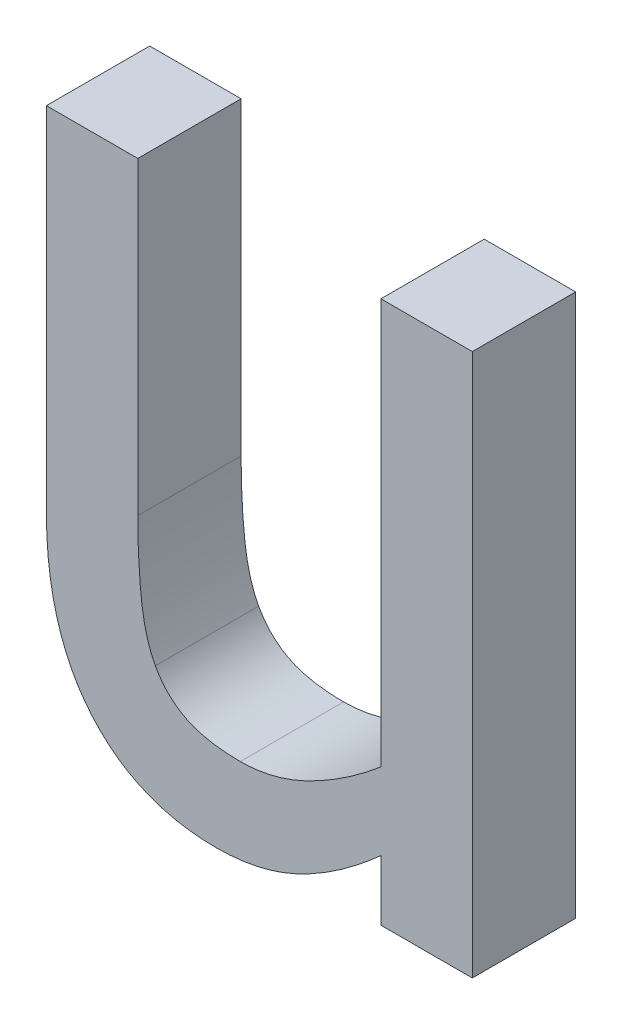
ISO-10303-21;
HEADER;
FILE_DESCRIPTION(('STEP AP214'),'2;1');
FILE_NAME('part.step','',(''),(''),'','','');
FILE_SCHEMA(('AUTOMOTIVE_DESIGN { 1 0 10303 214 1 1 1 1 }'));
ENDSEC;
DATA;
#1=APPLICATION_CONTEXT('core data for automotive mechanical design processes');
#2=APPLICATION_PROTOCOL_DEFINITION('international standard','automotive_design',2000,#1);
#3=PRODUCT_CONTEXT('',#1,'mechanical');
#4=PRODUCT('Part','Part','',(#3));
#5=PRODUCT_RELATED_PRODUCT_CATEGORY('part','',(#4));
#6=PRODUCT_DEFINITION_FORMATION('','',#4);
#7=PRODUCT_DEFINITION_CONTEXT('part definition',#1,'design');
#8=PRODUCT_DEFINITION('design','',#6,#7);
#9=PRODUCT_DEFINITION_SHAPE('','',#8);
#10=(LENGTH_UNIT() NAMED_UNIT(*) SI_UNIT(.MILLI.,.METRE.));
#11=(NAMED_UNIT(*) PLANE_ANGLE_UNIT() SI_UNIT($,.RADIAN.));
#12=(NAMED_UNIT(*) SI_UNIT($,.STERADIAN.) SOLID_ANGLE_UNIT());
#13=UNCERTAINTY_MEASURE_WITH_UNIT(LENGTH_MEASURE(1.E-05),#10,'distance_accuracy_value','');
#14=(GEOMETRIC_REPRESENTATION_CONTEXT(3) GLOBAL_UNCERTAINTY_ASSIGNED_CONTEXT((#13)) GLOBAL_UNIT_ASSIGNED_CONTEXT((#10,
#11,#12)) REPRESENTATION_CONTEXT('',''));
#15=CARTESIAN_POINT('',(0.,0.,0.));
#16=DIRECTION('',(0.,0.,1.));
#17=DIRECTION('',(1.,0.,0.));
#18=AXIS2_PLACEMENT_3D('',#15,#16,#17);
#19=CARTESIAN_POINT('',(-0.203772653395314,0.984918799111126,0.));
#20=DIRECTION('',(1.,0.,0.));
#21=DIRECTION('',(0.,1.,0.));
#22=AXIS2_PLACEMENT_3D('',#19,#20,#21);
#23=PLANE('',#22);
#24=DIRECTION('',(0.,-1.,0.));
#25=VECTOR('',#24,1.);
#26=CARTESIAN_POINT('',(-0.203772653395314,1.28436413185,0.));
#27=LINE('',#26,#25);
#28=CARTESIAN_POINT('',(-0.203772653395314,1.28436413185,0.));
#29=VERTEX_POINT('',#28);
#30=CARTESIAN_POINT('',(-0.203772653395314,0.984918799111126,0.));
#31=VERTEX_POINT('',#30);
#32=EDGE_CURVE('E11',#29,#31,#27,.T.);
#33=ORIENTED_EDGE('',*,*,#32,.F.);
#34=DIRECTION('',(0.,0.,1.));
#35=VECTOR('',#34,1.);
#36=CARTESIAN_POINT('',(-0.203772653395314,1.28436413185,0.));
#37=LINE('',#36,#35);
#38=CARTESIAN_POINT('',(-0.203772653395314,1.28436413185,0.1));
#39=VERTEX_POINT('',#38);
#40=EDGE_CURVE('E24',#29,#39,#37,.T.);
#41=ORIENTED_EDGE('',*,*,#40,.T.);
#42=DIRECTION('',(0.,1.,0.));
#43=VECTOR('',#42,1.);
#44=CARTESIAN_POINT('',(-0.203772653395314,1.28436413185,0.1));
#45=LINE('',#44,#43);
#46=CARTESIAN_POINT('',(-0.203772653395314,0.984918799111126,0.1));
#47=VERTEX_POINT('',#46);
#48=EDGE_CURVE('E130',#47,#39,#45,.T.);
#49=ORIENTED_EDGE('',*,*,#48,.F.);
#50=DIRECTION('',(0.,0.,1.));
#51=VECTOR('',#50,1.);
#52=CARTESIAN_POINT('',(-0.203772653395314,0.984918799111126,0.));
#53=LINE('',#52,#51);
#54=EDGE_CURVE('E258',#31,#47,#53,.T.);
#55=ORIENTED_EDGE('',*,*,#54,.F.);
#56=EDGE_LOOP('',(#33,#41,#49,#55));
#57=FACE_BOUND('',#56,.T.);
#58=ADVANCED_FACE('F17',(#57),#23,.T.);
#59=CARTESIAN_POINT('',(-0.186758714035148,0.867522617525982,0.));
#60=CARTESIAN_POINT('',(-0.186758714035148,0.867522617525982,0.1));
#61=CARTESIAN_POINT('',(-0.196967077651248,0.886237950822165,0.));
#62=CARTESIAN_POINT('',(-0.196967077651248,0.886237950822165,0.1));
#63=CARTESIAN_POINT('',(-0.203772653395314,0.948622395142772,0.));
#64=CARTESIAN_POINT('',(-0.203772653395314,0.948622395142772,0.1));
#65=CARTESIAN_POINT('',(-0.203772653395314,0.984918799111126,0.));
#66=CARTESIAN_POINT('',(-0.203772653395314,0.984918799111126,0.1));
#67=B_SPLINE_SURFACE_WITH_KNOTS('',2,1,((#59,#60),(#61,#62),(#63,#64),(#65,#66)),.UNSPECIFIED.,
.F.,.F.,.F.,(3,1,3),(2,2),(-2.,-1.,0.),(0.,0.01),.UNSPECIFIED.);
#68=CARTESIAN_POINT('',(-0.203772653395314,0.984918799111126,0.));
#69=CARTESIAN_POINT('',(-0.203772653395314,0.948622395142772,0.));
#70=CARTESIAN_POINT('',(-0.196967077651248,0.886237950822165,0.));
#71=CARTESIAN_POINT('',(-0.186758714035148,0.867522617525982,0.));
#72=B_SPLINE_CURVE_WITH_KNOTS('',2,(#68,#69,#70,#71),.UNSPECIFIED.,.F.,.F.,(3,1,3),(0.,1.,2.),.UNSPECIFIED.);
#73=CARTESIAN_POINT('',(-0.186758714035148,0.867522617525982,0.));
#74=VERTEX_POINT('',#73);
#75=EDGE_CURVE('E251',#31,#74,#72,.T.);
#76=CARTESIAN_POINT('',(-0.186758714035148,0.867522617525982,0.1));
#77=CARTESIAN_POINT('',(-0.196967077651248,0.886237950822165,0.1));
#78=CARTESIAN_POINT('',(-0.203772653395314,0.948622395142772,0.1));
#79=CARTESIAN_POINT('',(-0.203772653395314,0.984918799111126,0.1));
#80=B_SPLINE_CURVE_WITH_KNOTS('',2,(#76,#77,#78,#79),.UNSPECIFIED.,.F.,.F.,(3,1,3),(-2.,-1.,0.),.UNSPECIFIED.);
#81=CARTESIAN_POINT('',(-0.186758714035148,0.867522617525982,0.1));
#82=VERTEX_POINT('',#81);
#83=EDGE_CURVE('E247',#82,#47,#80,.T.);
#84=DIRECTION('',(0.,0.,1.));
#85=VECTOR('',#84,1.);
#86=CARTESIAN_POINT('',(-0.186758714035148,0.867522617525982,0.));
#87=LINE('',#86,#85);
#88=EDGE_CURVE('E241',#74,#82,#87,.T.);
#89=ORIENTED_EDGE('',*,*,#75,.F.);
#90=ORIENTED_EDGE('',*,*,#54,.T.);
#91=ORIENTED_EDGE('',*,*,#83,.F.);
#92=ORIENTED_EDGE('',*,*,#88,.F.);
#93=EDGE_LOOP('',(#89,#90,#91,#92));
#94=FACE_BOUND('',#93,.T.);
#95=ADVANCED_FACE('F303',(#94),#67,.T.);
#96=CARTESIAN_POINT('',(-0.104524673794347,0.828390556997601,0.));
#97=CARTESIAN_POINT('',(-0.104524673794347,0.828390556997601,0.1));
#98=CARTESIAN_POINT('',(-0.137418289890668,0.828390556997601,0.));
#99=CARTESIAN_POINT('',(-0.137418289890668,0.828390556997601,0.1));
#100=CARTESIAN_POINT('',(-0.175983219107043,0.847673021605789,0.));
#101=CARTESIAN_POINT('',(-0.175983219107043,0.847673021605789,0.1));
#102=CARTESIAN_POINT('',(-0.186758714035148,0.867522617525982,0.));
#103=CARTESIAN_POINT('',(-0.186758714035148,0.867522617525982,0.1));
#104=B_SPLINE_SURFACE_WITH_KNOTS('',2,1,((#96,#97),(#98,#99),(#100,#101),(#102,#103)),
.UNSPECIFIED.,.F.,.F.,.F.,(3,1,3),(2,2),(-2.,-1.,0.),(0.,0.01),.UNSPECIFIED.);
#105=CARTESIAN_POINT('',(-0.186758714035148,0.867522617525982,0.));
#106=CARTESIAN_POINT('',(-0.175983219107043,0.847673021605789,0.));
#107=CARTESIAN_POINT('',(-0.137418289890668,0.828390556997601,0.));
#108=CARTESIAN_POINT('',(-0.104524673794347,0.828390556997601,0.));
#109=B_SPLINE_CURVE_WITH_KNOTS('',2,(#105,#106,#107,#108),.UNSPECIFIED.,.F.,.F.,(3,1,3),(0.,1.,
2.),.UNSPECIFIED.);
#110=CARTESIAN_POINT('',(-0.104524673794347,0.828390556997601,0.));
#111=VERTEX_POINT('',#110);
#112=EDGE_CURVE('E234',#74,#111,#109,.T.);
#113=CARTESIAN_POINT('',(-0.104524673794347,0.828390556997601,0.1));
#114=CARTESIAN_POINT('',(-0.137418289890668,0.828390556997601,0.1));
#115=CARTESIAN_POINT('',(-0.175983219107043,0.847673021605789,0.1));
#116=CARTESIAN_POINT('',(-0.186758714035148,0.867522617525982,0.1));
#117=B_SPLINE_CURVE_WITH_KNOTS('',2,(#113,#114,#115,#116),.UNSPECIFIED.,.F.,.F.,(3,1,3),(-2.,
-1.,0.),.UNSPECIFIED.);
#118=CARTESIAN_POINT('',(-0.104524673794347,0.828390556997601,0.1));
#119=VERTEX_POINT('',#118);
#120=EDGE_CURVE('E229',#119,#82,#117,.T.);
#121=DIRECTION('',(0.,0.,1.));
#122=VECTOR('',#121,1.);
#123=CARTESIAN_POINT('',(-0.104524673794347,0.828390556997601,0.));
#124=LINE('',#123,#122);
#125=EDGE_CURVE('E223',#111,#119,#124,.T.);
#126=ORIENTED_EDGE('',*,*,#112,.F.);
#127=ORIENTED_EDGE('',*,*,#88,.T.);
#128=ORIENTED_EDGE('',*,*,#120,.F.);
#129=ORIENTED_EDGE('',*,*,#125,.F.);
#130=EDGE_LOOP('',(#126,#127,#128,#129));
#131=FACE_BOUND('',#130,.T.);
#132=ADVANCED_FACE('F299',(#131),#104,.T.);
#133=CARTESIAN_POINT('',(0.0315868410869785,0.89190926394222,0.));
#134=CARTESIAN_POINT('',(0.0315868410869785,0.89190926394222,0.1));
#135=CARTESIAN_POINT('',(-0.00187390632134743,0.863552698341944,0.));
#136=CARTESIAN_POINT('',(-0.00187390632134743,0.863552698341944,0.1));
#137=CARTESIAN_POINT('',(-0.0716310576980267,0.828390556997601,0.));
#138=CARTESIAN_POINT('',(-0.0716310576980267,0.828390556997601,0.1));
#139=CARTESIAN_POINT('',(-0.104524673794347,0.828390556997601,0.));
#140=CARTESIAN_POINT('',(-0.104524673794347,0.828390556997601,0.1));
#141=B_SPLINE_SURFACE_WITH_KNOTS('',2,1,((#133,#134),(#135,#136),(#137,#138),(#139,#140)),
.UNSPECIFIED.,.F.,.F.,.F.,(3,1,3),(2,2),(-2.,-1.,0.),(0.,0.01),.UNSPECIFIED.);
#142=CARTESIAN_POINT('',(-0.104524673794347,0.828390556997601,0.));
#143=CARTESIAN_POINT('',(-0.0716310576980267,0.828390556997601,0.));
#144=CARTESIAN_POINT('',(-0.00187390632134743,0.863552698341944,0.));
#145=CARTESIAN_POINT('',(0.0315868410869785,0.89190926394222,0.));
#146=B_SPLINE_CURVE_WITH_KNOTS('',2,(#142,#143,#144,#145),.UNSPECIFIED.,.F.,.F.,(3,1,3),(0.,1.,
2.),.UNSPECIFIED.);
#147=CARTESIAN_POINT('',(0.0315868410869785,0.89190926394222,0.));
#148=VERTEX_POINT('',#147);
#149=EDGE_CURVE('E216',#111,#148,#146,.T.);
#150=CARTESIAN_POINT('',(0.0315868410869785,0.89190926394222,0.1));
#151=CARTESIAN_POINT('',(-0.00187390632134743,0.863552698341944,0.1));
#152=CARTESIAN_POINT('',(-0.0716310576980267,0.828390556997601,0.1));
#153=CARTESIAN_POINT('',(-0.104524673794347,0.828390556997601,0.1));
#154=B_SPLINE_CURVE_WITH_KNOTS('',2,(#150,#151,#152,#153),.UNSPECIFIED.,.F.,.F.,(3,1,3),(-2.,
-1.,0.),.UNSPECIFIED.);
#155=CARTESIAN_POINT('',(0.0315868410869785,0.89190926394222,0.1));
#156=VERTEX_POINT('',#155);
#157=EDGE_CURVE('E211',#156,#119,#154,.T.);
#158=DIRECTION('',(0.,0.,1.));
#159=VECTOR('',#158,1.);
#160=CARTESIAN_POINT('',(0.0315868410869785,0.89190926394222,0.));
#161=LINE('',#160,#159);
#162=EDGE_CURVE('E208',#148,#156,#161,.T.);
#163=ORIENTED_EDGE('',*,*,#149,.F.);
#164=ORIENTED_EDGE('',*,*,#125,.T.);
#165=ORIENTED_EDGE('',*,*,#157,.F.);
#166=ORIENTED_EDGE('',*,*,#162,.F.);
#167=EDGE_LOOP('',(#163,#164,#165,#166));
#168=FACE_BOUND('',#167,.T.);
#169=ADVANCED_FACE('F295',(#168),#141,.T.);
#170=CARTESIAN_POINT('',(0.0315868410869785,1.28436413185,0.));
#171=DIRECTION('',(-1.,0.,0.));
#172=DIRECTION('',(0.,-1.,0.));
#173=AXIS2_PLACEMENT_3D('',#170,#171,#172);
#174=PLANE('',#173);
#175=DIRECTION('',(0.,1.,0.));
#176=VECTOR('',#175,1.);
#177=CARTESIAN_POINT('',(0.0315868410869785,0.89190926394222,0.));
#178=LINE('',#177,#176);
#179=CARTESIAN_POINT('',(0.0315868410869785,1.28436413185,0.));
#180=VERTEX_POINT('',#179);
#181=EDGE_CURVE('E206',#148,#180,#178,.T.);
#182=ORIENTED_EDGE('',*,*,#181,.F.);
#183=ORIENTED_EDGE('',*,*,#162,.T.);
#184=DIRECTION('',(0.,-1.,0.));
#185=VECTOR('',#184,1.);
#186=CARTESIAN_POINT('',(0.0315868410869785,0.89190926394222,0.1));
#187=LINE('',#186,#185);
#188=CARTESIAN_POINT('',(0.0315868410869785,1.28436413185,0.1));
#189=VERTEX_POINT('',#188);
#190=EDGE_CURVE('E203',#189,#156,#187,.T.);
#191=ORIENTED_EDGE('',*,*,#190,.F.);
#192=DIRECTION('',(0.,0.,1.));
#193=VECTOR('',#192,1.);
#194=CARTESIAN_POINT('',(0.0315868410869785,1.28436413185,0.));
#195=LINE('',#194,#193);
#196=EDGE_CURVE('E200',#180,#189,#195,.T.);
#197=ORIENTED_EDGE('',*,*,#196,.F.);
#198=EDGE_LOOP('',(#182,#183,#191,#197));
#199=FACE_BOUND('',#198,.T.);
#200=ADVANCED_FACE('F291',(#199),#174,.T.);
#201=CARTESIAN_POINT('',(0.12005932575984,1.28436413185,0.));
#202=DIRECTION('',(0.,1.,0.));
#203=DIRECTION('',(-1.,0.,0.));
#204=AXIS2_PLACEMENT_3D('',#201,#202,#203);
#205=PLANE('',#204);
#206=DIRECTION('',(1.,0.,0.));
#207=VECTOR('',#206,1.);
#208=CARTESIAN_POINT('',(0.0315868410869785,1.28436413185,0.));
#209=LINE('',#208,#207);
#210=CARTESIAN_POINT('',(0.12005932575984,1.28436413185,0.));
#211=VERTEX_POINT('',#210);
#212=EDGE_CURVE('E198',#180,#211,#209,.T.);
#213=ORIENTED_EDGE('',*,*,#212,.F.);
#214=ORIENTED_EDGE('',*,*,#196,.T.);
#215=DIRECTION('',(-1.,0.,0.));
#216=VECTOR('',#215,1.);
#217=CARTESIAN_POINT('',(0.0315868410869785,1.28436413185,0.1));
#218=LINE('',#217,#216);
#219=CARTESIAN_POINT('',(0.12005932575984,1.28436413185,0.1));
#220=VERTEX_POINT('',#219);
#221=EDGE_CURVE('E195',#220,#189,#218,.T.);
#222=ORIENTED_EDGE('',*,*,#221,.F.);
#223=DIRECTION('',(0.,0.,1.));
#224=VECTOR('',#223,1.);
#225=CARTESIAN_POINT('',(0.12005932575984,1.28436413185,0.));
#226=LINE('',#225,#224);
#227=EDGE_CURVE('E192',#211,#220,#226,.T.);
#228=ORIENTED_EDGE('',*,*,#227,.F.);
#229=EDGE_LOOP('',(#213,#214,#222,#228));
#230=FACE_BOUND('',#229,.T.);
#231=ADVANCED_FACE('F287',(#230),#205,.T.);
#232=CARTESIAN_POINT('',(0.12005932575984,0.759200536932927,0.));
#233=DIRECTION('',(1.,0.,0.));
#234=DIRECTION('',(0.,1.,0.));
#235=AXIS2_PLACEMENT_3D('',#232,#233,#234);
#236=PLANE('',#235);
#237=DIRECTION('',(0.,-1.,0.));
#238=VECTOR('',#237,1.);
#239=CARTESIAN_POINT('',(0.12005932575984,1.28436413185,0.));
#240=LINE('',#239,#238);
#241=CARTESIAN_POINT('',(0.12005932575984,0.759200536932927,0.));
#242=VERTEX_POINT('',#241);
#243=EDGE_CURVE('E190',#211,#242,#240,.T.);
#244=ORIENTED_EDGE('',*,*,#243,.F.);
#245=ORIENTED_EDGE('',*,*,#227,.T.);
#246=DIRECTION('',(0.,1.,0.));
#247=VECTOR('',#246,1.);
#248=CARTESIAN_POINT('',(0.12005932575984,1.28436413185,0.1));
#249=LINE('',#248,#247);
#250=CARTESIAN_POINT('',(0.12005932575984,0.759200536932927,0.1));
#251=VERTEX_POINT('',#250);
#252=EDGE_CURVE('E187',#251,#220,#249,.T.);
#253=ORIENTED_EDGE('',*,*,#252,.F.);
#254=DIRECTION('',(0.,0.,1.));
#255=VECTOR('',#254,1.);
#256=CARTESIAN_POINT('',(0.12005932575984,0.759200536932927,0.));
#257=LINE('',#256,#255);
#258=EDGE_CURVE('E184',#242,#251,#257,.T.);
#259=ORIENTED_EDGE('',*,*,#258,.F.);
#260=EDGE_LOOP('',(#244,#245,#253,#259));
#261=FACE_BOUND('',#260,.T.);
#262=ADVANCED_FACE('F283',(#261),#236,.T.);
#263=CARTESIAN_POINT('',(0.0315868410869785,0.759200536932927,0.));
#264=DIRECTION('',(0.,-1.,0.));
#265=DIRECTION('',(1.,0.,0.));
#266=AXIS2_PLACEMENT_3D('',#263,#264,#265);
#267=PLANE('',#266);
#268=DIRECTION('',(-1.,0.,0.));
#269=VECTOR('',#268,1.);
#270=CARTESIAN_POINT('',(0.12005932575984,0.759200536932927,0.));
#271=LINE('',#270,#269);
#272=CARTESIAN_POINT('',(0.0315868410869785,0.759200536932927,0.));
#273=VERTEX_POINT('',#272);
#274=EDGE_CURVE('E182',#242,#273,#271,.T.);
#275=ORIENTED_EDGE('',*,*,#274,.F.);
#276=ORIENTED_EDGE('',*,*,#258,.T.);
#277=DIRECTION('',(1.,0.,0.));
#278=VECTOR('',#277,1.);
#279=CARTESIAN_POINT('',(0.12005932575984,0.759200536932927,0.1));
#280=LINE('',#279,#278);
#281=CARTESIAN_POINT('',(0.0315868410869785,0.759200536932927,0.1));
#282=VERTEX_POINT('',#281);
#283=EDGE_CURVE('E179',#282,#251,#280,.T.);
#284=ORIENTED_EDGE('',*,*,#283,.F.);
#285=DIRECTION('',(0.,0.,1.));
#286=VECTOR('',#285,1.);
#287=CARTESIAN_POINT('',(0.0315868410869785,0.759200536932927,0.));
#288=LINE('',#287,#286);
#289=EDGE_CURVE('E176',#273,#282,#288,.T.);
#290=ORIENTED_EDGE('',*,*,#289,.F.);
#291=EDGE_LOOP('',(#275,#276,#284,#290));
#292=FACE_BOUND('',#291,.T.);
#293=ADVANCED_FACE('F279',(#292),#267,.T.);
#294=CARTESIAN_POINT('',(0.0315868410869785,0.817615062069496,0.));
#295=DIRECTION('',(-1.,0.,0.));
#296=DIRECTION('',(0.,-1.,0.));
#297=AXIS2_PLACEMENT_3D('',#294,#295,#296);
#298=PLANE('',#297);
#299=DIRECTION('',(0.,1.,0.));
#300=VECTOR('',#299,1.);
#301=CARTESIAN_POINT('',(0.0315868410869785,0.759200536932927,0.));
#302=LINE('',#301,#300);
#303=CARTESIAN_POINT('',(0.0315868410869785,0.817615062069496,0.));
#304=VERTEX_POINT('',#303);
#305=EDGE_CURVE('E174',#273,#304,#302,.T.);
#306=ORIENTED_EDGE('',*,*,#305,.F.);
#307=ORIENTED_EDGE('',*,*,#289,.T.);
#308=DIRECTION('',(0.,-1.,0.));
#309=VECTOR('',#308,1.);
#310=CARTESIAN_POINT('',(0.0315868410869785,0.759200536932927,0.1));
#311=LINE('',#310,#309);
#312=CARTESIAN_POINT('',(0.0315868410869785,0.817615062069496,0.1));
#313=VERTEX_POINT('',#312);
#314=EDGE_CURVE('E171',#313,#282,#311,.T.);
#315=ORIENTED_EDGE('',*,*,#314,.F.);
#316=DIRECTION('',(0.,0.,1.));
#317=VECTOR('',#316,1.);
#318=CARTESIAN_POINT('',(0.0315868410869785,0.817615062069496,0.));
#319=LINE('',#318,#317);
#320=EDGE_CURVE('E165',#304,#313,#319,.T.);
#321=ORIENTED_EDGE('',*,*,#320,.F.);
#322=EDGE_LOOP('',(#306,#307,#315,#321));
#323=FACE_BOUND('',#322,.T.);
#324=ADVANCED_FACE('F275',(#323),#298,.T.);
#325=CARTESIAN_POINT('',(-0.127777057586574,0.744455122820784,0.));
#326=CARTESIAN_POINT('',(-0.127777057586574,0.744455122820784,0.1));
#327=CARTESIAN_POINT('',(-0.084675077874154,0.744455122820784,0.));
#328=CARTESIAN_POINT('',(-0.084675077874154,0.744455122820784,0.1));
#329=CARTESIAN_POINT('',(-0.0081123507534081,0.781885789413148,0.));
#330=CARTESIAN_POINT('',(-0.0081123507534081,0.781885789413148,0.1));
#331=CARTESIAN_POINT('',(0.0315868410869785,0.817615062069496,0.));
#332=CARTESIAN_POINT('',(0.0315868410869785,0.817615062069496,0.1));
#333=B_SPLINE_SURFACE_WITH_KNOTS('',2,1,((#325,#326),(#327,#328),(#329,#330),(#331,#332)),
.UNSPECIFIED.,.F.,.F.,.F.,(3,1,3),(2,2),(-2.,-1.,0.),(0.,0.01),.UNSPECIFIED.);
#334=CARTESIAN_POINT('',(0.0315868410869785,0.817615062069496,0.));
#335=CARTESIAN_POINT('',(-0.0081123507534081,0.781885789413148,0.));
#336=CARTESIAN_POINT('',(-0.084675077874154,0.744455122820784,0.));
#337=CARTESIAN_POINT('',(-0.127777057586574,0.744455122820784,0.));
#338=B_SPLINE_CURVE_WITH_KNOTS('',2,(#334,#335,#336,#337),.UNSPECIFIED.,.F.,.F.,(3,1,3),(0.,1.,
2.),.UNSPECIFIED.);
#339=CARTESIAN_POINT('',(-0.127777057586574,0.744455122820784,0.));
#340=VERTEX_POINT('',#339);
#341=EDGE_CURVE('E158',#304,#340,#338,.T.);
#342=CARTESIAN_POINT('',(-0.127777057586574,0.744455122820784,0.1));
#343=CARTESIAN_POINT('',(-0.084675077874154,0.744455122820784,0.1));
#344=CARTESIAN_POINT('',(-0.0081123507534081,0.781885789413148,0.1));
#345=CARTESIAN_POINT('',(0.0315868410869785,0.817615062069496,0.1));
#346=B_SPLINE_CURVE_WITH_KNOTS('',2,(#342,#343,#344,#345),.UNSPECIFIED.,.F.,.F.,(3,1,3),(-2.,
-1.,0.),.UNSPECIFIED.);
#347=CARTESIAN_POINT('',(-0.127777057586574,0.744455122820784,0.1));
#348=VERTEX_POINT('',#347);
#349=EDGE_CURVE('E153',#348,#313,#346,.T.);
#350=DIRECTION('',(0.,0.,1.));
#351=VECTOR('',#350,1.);
#352=CARTESIAN_POINT('',(-0.127777057586574,0.744455122820784,0.));
#353=LINE('',#352,#351);
#354=EDGE_CURVE('E147',#340,#348,#353,.T.);
#355=ORIENTED_EDGE('',*,*,#341,.F.);
#356=ORIENTED_EDGE('',*,*,#320,.T.);
#357=ORIENTED_EDGE('',*,*,#349,.F.);
#358=ORIENTED_EDGE('',*,*,#354,.F.);
#359=EDGE_LOOP('',(#355,#356,#357,#358));
#360=FACE_BOUND('',#359,.T.);
#361=ADVANCED_FACE('F271',(#360),#333,.T.);
#362=CARTESIAN_POINT('',(-0.292245138068176,0.943518213334723,0.));
#363=CARTESIAN_POINT('',(-0.292245138068176,0.943518213334723,0.1));
#364=CARTESIAN_POINT('',(-0.292245138068176,0.846538758981778,0.));
#365=CARTESIAN_POINT('',(-0.292245138068176,0.846538758981778,0.1));
#366=CARTESIAN_POINT('',(-0.204906916019325,0.744455122820784,0.));
#367=CARTESIAN_POINT('',(-0.204906916019325,0.744455122820784,0.1));
#368=CARTESIAN_POINT('',(-0.127777057586574,0.744455122820784,0.));
#369=CARTESIAN_POINT('',(-0.127777057586574,0.744455122820784,0.1));
#370=B_SPLINE_SURFACE_WITH_KNOTS('',2,1,((#362,#363),(#364,#365),(#366,#367),(#368,#369)),
.UNSPECIFIED.,.F.,.F.,.F.,(3,1,3),(2,2),(-2.,-1.,0.),(0.,0.01),.UNSPECIFIED.);
#371=CARTESIAN_POINT('',(-0.127777057586574,0.744455122820784,0.));
#372=CARTESIAN_POINT('',(-0.204906916019325,0.744455122820784,0.));
#373=CARTESIAN_POINT('',(-0.292245138068176,0.846538758981778,0.));
#374=CARTESIAN_POINT('',(-0.292245138068176,0.943518213334723,0.));
#375=B_SPLINE_CURVE_WITH_KNOTS('',2,(#371,#372,#373,#374),.UNSPECIFIED.,.F.,.F.,(3,1,3),(0.,1.,
2.),.UNSPECIFIED.);
#376=CARTESIAN_POINT('',(-0.292245138068176,0.943518213334722,0.));
#377=VERTEX_POINT('',#376);
#378=EDGE_CURVE('E140',#340,#377,#375,.T.);
#379=CARTESIAN_POINT('',(-0.292245138068176,0.943518213334723,0.1));
#380=CARTESIAN_POINT('',(-0.292245138068176,0.846538758981778,0.1));
#381=CARTESIAN_POINT('',(-0.204906916019325,0.744455122820784,0.1));
#382=CARTESIAN_POINT('',(-0.127777057586574,0.744455122820784,0.1));
#383=B_SPLINE_CURVE_WITH_KNOTS('',2,(#379,#380,#381,#382),.UNSPECIFIED.,.F.,.F.,(3,1,3),(-2.,
-1.,0.),.UNSPECIFIED.);
#384=CARTESIAN_POINT('',(-0.292245138068176,0.943518213334722,0.1));
#385=VERTEX_POINT('',#384);
#386=EDGE_CURVE('E136',#385,#348,#383,.T.);
#387=DIRECTION('',(0.,0.,1.));
#388=VECTOR('',#387,1.);
#389=CARTESIAN_POINT('',(-0.292245138068176,0.943518213334722,0.));
#390=LINE('',#389,#388);
#391=EDGE_CURVE('E115',#377,#385,#390,.T.);
#392=ORIENTED_EDGE('',*,*,#378,.F.);
#393=ORIENTED_EDGE('',*,*,#354,.T.);
#394=ORIENTED_EDGE('',*,*,#386,.F.);
#395=ORIENTED_EDGE('',*,*,#391,.F.);
#396=EDGE_LOOP('',(#392,#393,#394,#395));
#397=FACE_BOUND('',#396,.T.);
#398=ADVANCED_FACE('F269',(#397),#370,.T.);
#399=CARTESIAN_POINT('',(-0.292245138068176,1.28436413185,0.));
#400=DIRECTION('',(-1.,0.,0.));
#401=DIRECTION('',(0.,-1.,0.));
#402=AXIS2_PLACEMENT_3D('',#399,#400,#401);
#403=PLANE('',#402);
#404=DIRECTION('',(0.,1.,0.));
#405=VECTOR('',#404,1.);
#406=CARTESIAN_POINT('',(-0.292245138068176,0.943518213334722,0.));
#407=LINE('',#406,#405);
#408=CARTESIAN_POINT('',(-0.292245138068176,1.28436413185,0.));
#409=VERTEX_POINT('',#408);
#410=EDGE_CURVE('E119',#377,#409,#407,.T.);
#411=ORIENTED_EDGE('',*,*,#410,.F.);
#412=ORIENTED_EDGE('',*,*,#391,.T.);
#413=DIRECTION('',(0.,-1.,0.));
#414=VECTOR('',#413,1.);
#415=CARTESIAN_POINT('',(-0.292245138068176,0.943518213334722,0.1));
#416=LINE('',#415,#414);
#417=CARTESIAN_POINT('',(-0.292245138068176,1.28436413185,0.1));
#418=VERTEX_POINT('',#417);
#419=EDGE_CURVE('E108',#418,#385,#416,.T.);
#420=ORIENTED_EDGE('',*,*,#419,.F.);
#421=DIRECTION('',(0.,0.,1.));
#422=VECTOR('',#421,1.);
#423=CARTESIAN_POINT('',(-0.292245138068176,1.28436413185,0.));
#424=LINE('',#423,#422);
#425=EDGE_CURVE('E112',#409,#418,#424,.T.);
#426=ORIENTED_EDGE('',*,*,#425,.F.);
#427=EDGE_LOOP('',(#411,#412,#420,#426));
#428=FACE_BOUND('',#427,.T.);
#429=ADVANCED_FACE('F111',(#428),#403,.T.);
#430=CARTESIAN_POINT('',(-0.203772653395314,1.28436413185,0.));
#431=DIRECTION('',(0.,1.,0.));
#432=DIRECTION('',(-1.,0.,0.));
#433=AXIS2_PLACEMENT_3D('',#430,#431,#432);
#434=PLANE('',#433);
#435=DIRECTION('',(1.,0.,0.));
#436=VECTOR('',#435,1.);
#437=CARTESIAN_POINT('',(-0.292245138068176,1.28436413185,0.));
#438=LINE('',#437,#436);
#439=EDGE_CURVE('E125',#409,#29,#438,.T.);
#440=ORIENTED_EDGE('',*,*,#439,.F.);
#441=ORIENTED_EDGE('',*,*,#425,.T.);
#442=DIRECTION('',(-1.,0.,0.));
#443=VECTOR('',#442,1.);
#444=CARTESIAN_POINT('',(-0.292245138068176,1.28436413185,0.1));
#445=LINE('',#444,#443);
#446=EDGE_CURVE('E124',#39,#418,#445,.T.);
#447=ORIENTED_EDGE('',*,*,#446,.F.);
#448=ORIENTED_EDGE('',*,*,#40,.F.);
#449=EDGE_LOOP('',(#440,#441,#447,#448));
#450=FACE_BOUND('',#449,.T.);
#451=ADVANCED_FACE('F123',(#450),#434,.T.);
#452=CARTESIAN_POINT('',(-0.0727383060215168,1.01419602195,0.));
#453=DIRECTION('',(0.,0.,1.));
#454=DIRECTION('',(1.,0.,0.));
#455=AXIS2_PLACEMENT_3D('',#452,#453,#454);
#456=PLANE('',#455);
#457=ORIENTED_EDGE('',*,*,#439,.T.);
#458=ORIENTED_EDGE('',*,*,#32,.T.);
#459=ORIENTED_EDGE('',*,*,#75,.T.);
#460=ORIENTED_EDGE('',*,*,#112,.T.);
#461=ORIENTED_EDGE('',*,*,#149,.T.);
#462=ORIENTED_EDGE('',*,*,#181,.T.);
#463=ORIENTED_EDGE('',*,*,#212,.T.);
#464=ORIENTED_EDGE('',*,*,#243,.T.);
#465=ORIENTED_EDGE('',*,*,#274,.T.);
#466=ORIENTED_EDGE('',*,*,#305,.T.);
#467=ORIENTED_EDGE('',*,*,#341,.T.);
#468=ORIENTED_EDGE('',*,*,#378,.T.);
#469=ORIENTED_EDGE('',*,*,#410,.T.);
#470=EDGE_LOOP('',(#457,#458,#459,#460,#461,#462,#463,#464,#465,#466,#467,#468,#469));
#471=FACE_BOUND('',#470,.T.);
#472=ADVANCED_FACE('F264',(#471),#456,.F.);
#473=CARTESIAN_POINT('',(-0.0727383060215168,1.01419602195,0.1));
#474=DIRECTION('',(0.,0.,1.));
#475=DIRECTION('',(1.,0.,0.));
#476=AXIS2_PLACEMENT_3D('',#473,#474,#475);
#477=PLANE('',#476);
#478=ORIENTED_EDGE('',*,*,#446,.T.);
#479=ORIENTED_EDGE('',*,*,#419,.T.);
#480=ORIENTED_EDGE('',*,*,#386,.T.);
#481=ORIENTED_EDGE('',*,*,#349,.T.);
#482=ORIENTED_EDGE('',*,*,#314,.T.);
#483=ORIENTED_EDGE('',*,*,#283,.T.);
#484=ORIENTED_EDGE('',*,*,#252,.T.);
#485=ORIENTED_EDGE('',*,*,#221,.T.);
#486=ORIENTED_EDGE('',*,*,#190,.T.);
#487=ORIENTED_EDGE('',*,*,#157,.T.);
#488=ORIENTED_EDGE('',*,*,#120,.T.);
#489=ORIENTED_EDGE('',*,*,#83,.T.);
#490=ORIENTED_EDGE('',*,*,#48,.T.);
#491=EDGE_LOOP('',(#478,#479,#480,#481,#482,#483,#484,#485,#486,#487,#488,#489,#490));
#492=FACE_BOUND('',#491,.T.);
#493=ADVANCED_FACE('F128',(#492),#477,.T.);
#494=CLOSED_SHELL('',(#58,#95,#132,#169,#200,#231,#262,#293,#324,#361,#398,#429,#451,#472,#493));
#495=MANIFOLD_SOLID_BREP('B1',#494);
#496=ADVANCED_BREP_SHAPE_REPRESENTATION('',(#18,#495),#14);
#497=SHAPE_DEFINITION_REPRESENTATION(#9,#496);
ENDSEC;
END-ISO-10303-21;
